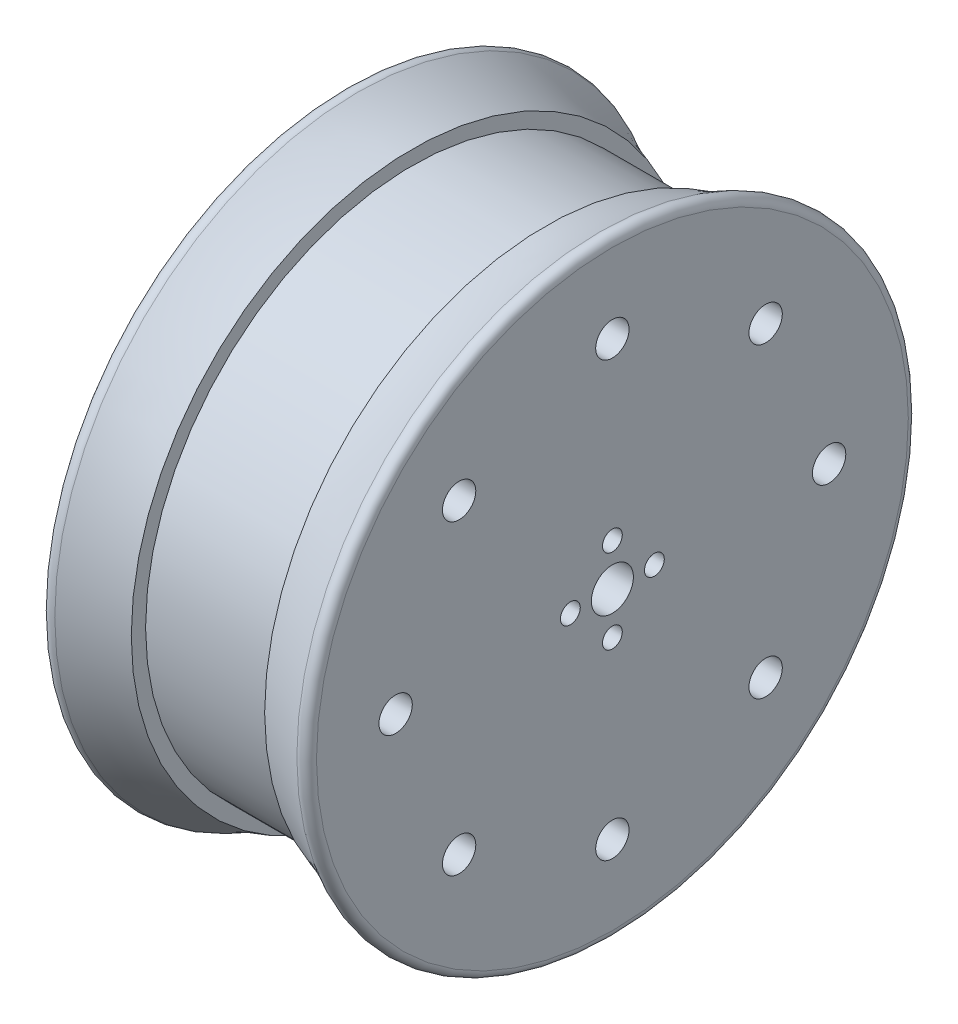
ISO-10303-21;
HEADER;
FILE_DESCRIPTION(('STEP AP214'),'2;1');
FILE_NAME('part.step','',(''),(''),'','','');
FILE_SCHEMA(('AUTOMOTIVE_DESIGN { 1 0 10303 214 1 1 1 1 }'));
ENDSEC;
DATA;
#1=APPLICATION_CONTEXT('core data for automotive mechanical design processes');
#2=APPLICATION_PROTOCOL_DEFINITION('international standard','automotive_design',2000,#1);
#3=PRODUCT_CONTEXT('',#1,'mechanical');
#4=PRODUCT('Part','Part','',(#3));
#5=PRODUCT_RELATED_PRODUCT_CATEGORY('part','',(#4));
#6=PRODUCT_DEFINITION_FORMATION('','',#4);
#7=PRODUCT_DEFINITION_CONTEXT('part definition',#1,'design');
#8=PRODUCT_DEFINITION('design','',#6,#7);
#9=PRODUCT_DEFINITION_SHAPE('','',#8);
#10=(LENGTH_UNIT() NAMED_UNIT(*) SI_UNIT(.MILLI.,.METRE.));
#11=(NAMED_UNIT(*) PLANE_ANGLE_UNIT() SI_UNIT($,.RADIAN.));
#12=(NAMED_UNIT(*) SI_UNIT($,.STERADIAN.) SOLID_ANGLE_UNIT());
#13=UNCERTAINTY_MEASURE_WITH_UNIT(LENGTH_MEASURE(1.E-05),#10,'distance_accuracy_value','');
#14=(GEOMETRIC_REPRESENTATION_CONTEXT(3) GLOBAL_UNCERTAINTY_ASSIGNED_CONTEXT((#13)) GLOBAL_UNIT_ASSIGNED_CONTEXT((#10,
#11,#12)) REPRESENTATION_CONTEXT('',''));
#15=CARTESIAN_POINT('',(0.,0.,0.));
#16=DIRECTION('',(0.,0.,1.));
#17=DIRECTION('',(1.,0.,0.));
#18=AXIS2_PLACEMENT_3D('',#15,#16,#17);
#19=CARTESIAN_POINT('',(25.4,0.,0.));
#20=DIRECTION('',(1.,0.,0.));
#21=DIRECTION('',(0.,0.,-1.));
#22=AXIS2_PLACEMENT_3D('',#19,#20,#21);
#23=PLANE('',#22);
#24=CARTESIAN_POINT('',(25.4,29.1858323934735,29.1858323934742));
#25=DIRECTION('',(1.,0.,0.));
#26=DIRECTION('',(0.,0.,-1.));
#27=AXIS2_PLACEMENT_3D('',#24,#25,#26);
#28=CIRCLE('',#27,3.17500000000134);
#29=CARTESIAN_POINT('',(25.4,29.1858323934735,26.0108323934729));
#30=VERTEX_POINT('',#29);
#31=EDGE_CURVE('E136',#30,#30,#28,.T.);
#32=ORIENTED_EDGE('',*,*,#31,.F.);
#33=EDGE_LOOP('',(#32));
#34=FACE_BOUND('',#33,.T.);
#35=CARTESIAN_POINT('',(25.4,-1.75965908510989E-12,41.2749999999982));
#36=DIRECTION('',(1.,0.,0.));
#37=DIRECTION('',(0.,0.,-1.));
#38=AXIS2_PLACEMENT_3D('',#35,#36,#37);
#39=CIRCLE('',#38,3.1750000000026);
#40=CARTESIAN_POINT('',(25.4,-1.75965908510989E-12,38.0999999999956));
#41=VERTEX_POINT('',#40);
#42=EDGE_CURVE('E130',#41,#41,#39,.T.);
#43=ORIENTED_EDGE('',*,*,#42,.F.);
#44=EDGE_LOOP('',(#43));
#45=FACE_BOUND('',#44,.T.);
#46=CARTESIAN_POINT('',(25.4,-29.185832393476,29.1858323934718));
#47=DIRECTION('',(1.,0.,0.));
#48=DIRECTION('',(0.,0.,-1.));
#49=AXIS2_PLACEMENT_3D('',#46,#47,#48);
#50=CIRCLE('',#49,3.17500000000357);
#51=CARTESIAN_POINT('',(25.4,-29.185832393476,26.0108323934682));
#52=VERTEX_POINT('',#51);
#53=EDGE_CURVE('E124',#52,#52,#50,.T.);
#54=ORIENTED_EDGE('',*,*,#53,.F.);
#55=EDGE_LOOP('',(#54));
#56=FACE_BOUND('',#55,.T.);
#57=CARTESIAN_POINT('',(25.4,-41.275,-3.50920871089281E-12));
#58=DIRECTION('',(1.,0.,0.));
#59=DIRECTION('',(0.,0.,-1.));
#60=AXIS2_PLACEMENT_3D('',#57,#58,#59);
#61=CIRCLE('',#60,3.17500000000363);
#62=CARTESIAN_POINT('',(25.4,-41.275,-3.17500000000714));
#63=VERTEX_POINT('',#62);
#64=EDGE_CURVE('E118',#63,#63,#61,.T.);
#65=ORIENTED_EDGE('',*,*,#64,.F.);
#66=EDGE_LOOP('',(#65));
#67=FACE_BOUND('',#66,.T.);
#68=CARTESIAN_POINT('',(25.4,-29.1858323934735,-29.1858323934777));
#69=DIRECTION('',(1.,0.,0.));
#70=DIRECTION('',(0.,0.,-1.));
#71=AXIS2_PLACEMENT_3D('',#68,#69,#70);
#72=CIRCLE('',#71,3.17500000000271);
#73=CARTESIAN_POINT('',(25.4,-29.1858323934735,-32.3608323934805));
#74=VERTEX_POINT('',#73);
#75=EDGE_CURVE('E112',#74,#74,#72,.T.);
#76=ORIENTED_EDGE('',*,*,#75,.F.);
#77=EDGE_LOOP('',(#76));
#78=FACE_BOUND('',#77,.T.);
#79=CARTESIAN_POINT('',(25.4,1.75460435544641E-12,-41.2750000000018));
#80=DIRECTION('',(1.,0.,0.));
#81=DIRECTION('',(0.,0.,-1.));
#82=AXIS2_PLACEMENT_3D('',#79,#80,#81);
#83=CIRCLE('',#82,3.1750000000013);
#84=CARTESIAN_POINT('',(25.4,1.75460435544641E-12,-44.4500000000031));
#85=VERTEX_POINT('',#84);
#86=EDGE_CURVE('E106',#85,#85,#83,.T.);
#87=ORIENTED_EDGE('',*,*,#86,.F.);
#88=EDGE_LOOP('',(#87));
#89=FACE_BOUND('',#88,.T.);
#90=CARTESIAN_POINT('',(25.4,29.185832393476,-29.1858323934753));
#91=DIRECTION('',(1.,0.,0.));
#92=DIRECTION('',(0.,0.,-1.));
#93=AXIS2_PLACEMENT_3D('',#90,#91,#92);
#94=CIRCLE('',#93,3.17500000000019);
#95=CARTESIAN_POINT('',(25.4,29.185832393476,-32.3608323934755));
#96=VERTEX_POINT('',#95);
#97=EDGE_CURVE('E100',#96,#96,#94,.T.);
#98=ORIENTED_EDGE('',*,*,#97,.F.);
#99=EDGE_LOOP('',(#98));
#100=FACE_BOUND('',#99,.T.);
#101=CARTESIAN_POINT('',(25.4,41.275,0.));
#102=DIRECTION('',(1.,0.,0.));
#103=DIRECTION('',(0.,0.,-1.));
#104=AXIS2_PLACEMENT_3D('',#101,#102,#103);
#105=CIRCLE('',#104,3.175);
#106=CARTESIAN_POINT('',(25.4,41.275,-3.175));
#107=VERTEX_POINT('',#106);
#108=EDGE_CURVE('E94',#107,#107,#105,.T.);
#109=ORIENTED_EDGE('',*,*,#108,.F.);
#110=EDGE_LOOP('',(#109));
#111=FACE_BOUND('',#110,.T.);
#112=CARTESIAN_POINT('',(25.4,0.,0.));
#113=DIRECTION('',(1.,0.,0.));
#114=DIRECTION('',(0.,0.,-1.));
#115=AXIS2_PLACEMENT_3D('',#112,#113,#114);
#116=CIRCLE('',#115,56.3572046071545);
#117=CARTESIAN_POINT('',(25.4,0.,-56.3572046071545));
#118=VERTEX_POINT('',#117);
#119=EDGE_CURVE('E42',#118,#118,#116,.T.);
#120=ORIENTED_EDGE('',*,*,#119,.T.);
#121=EDGE_LOOP('',(#120));
#122=FACE_BOUND('',#121,.T.);
#123=CARTESIAN_POINT('',(25.4,-4.57011557697138E-13,7.99999999999954));
#124=DIRECTION('',(1.,0.,0.));
#125=DIRECTION('',(0.,0.,-1.));
#126=AXIS2_PLACEMENT_3D('',#123,#124,#125);
#127=CIRCLE('',#126,1.88500000000098);
#128=CARTESIAN_POINT('',(25.4,-4.57011557697138E-13,6.11499999999856));
#129=VERTEX_POINT('',#128);
#130=EDGE_CURVE('E88',#129,#129,#127,.T.);
#131=ORIENTED_EDGE('',*,*,#130,.F.);
#132=EDGE_LOOP('',(#131));
#133=FACE_BOUND('',#132,.T.);
#134=CARTESIAN_POINT('',(25.4,-8.,-9.12063680515641E-13));
#135=DIRECTION('',(1.,0.,0.));
#136=DIRECTION('',(0.,0.,-1.));
#137=AXIS2_PLACEMENT_3D('',#134,#135,#136);
#138=CIRCLE('',#137,1.88500000000098);
#139=CARTESIAN_POINT('',(25.4,-8.,-1.88500000000189));
#140=VERTEX_POINT('',#139);
#141=EDGE_CURVE('E82',#140,#140,#138,.T.);
#142=ORIENTED_EDGE('',*,*,#141,.F.);
#143=EDGE_LOOP('',(#142));
#144=FACE_BOUND('',#143,.T.);
#145=CARTESIAN_POINT('',(25.4,4.56031840257821E-13,-8.00000000000045));
#146=DIRECTION('',(1.,0.,0.));
#147=DIRECTION('',(0.,0.,-1.));
#148=AXIS2_PLACEMENT_3D('',#145,#146,#147);
#149=CIRCLE('',#148,1.88500000000098);
#150=CARTESIAN_POINT('',(25.4,4.56031840257821E-13,-9.88500000000144));
#151=VERTEX_POINT('',#150);
#152=EDGE_CURVE('E76',#151,#151,#149,.T.);
#153=ORIENTED_EDGE('',*,*,#152,.F.);
#154=EDGE_LOOP('',(#153));
#155=FACE_BOUND('',#154,.T.);
#156=CARTESIAN_POINT('',(25.4,8.,0.));
#157=DIRECTION('',(1.,0.,0.));
#158=DIRECTION('',(0.,0.,-1.));
#159=AXIS2_PLACEMENT_3D('',#156,#157,#158);
#160=CIRCLE('',#159,1.88500000000098);
#161=CARTESIAN_POINT('',(25.4,8.,-1.88500000000098));
#162=VERTEX_POINT('',#161);
#163=EDGE_CURVE('E70',#162,#162,#160,.T.);
#164=ORIENTED_EDGE('',*,*,#163,.F.);
#165=EDGE_LOOP('',(#164));
#166=FACE_BOUND('',#165,.T.);
#167=CARTESIAN_POINT('',(25.4,0.,0.));
#168=DIRECTION('',(1.,0.,0.));
#169=DIRECTION('',(0.,0.,-1.));
#170=AXIS2_PLACEMENT_3D('',#167,#168,#169);
#171=CIRCLE('',#170,4.);
#172=CARTESIAN_POINT('',(25.4,0.,-4.));
#173=VERTEX_POINT('',#172);
#174=EDGE_CURVE('E64',#173,#173,#171,.T.);
#175=ORIENTED_EDGE('',*,*,#174,.F.);
#176=EDGE_LOOP('',(#175));
#177=FACE_BOUND('',#176,.T.);
#178=ADVANCED_FACE('F31',(#34,#45,#56,#67,#78,#89,#100,#111,#122,#133,#144,#155,#166,#177),#23,.T.);
#179=CARTESIAN_POINT('',(0.,0.,0.));
#180=DIRECTION('',(-1.,0.,0.));
#181=DIRECTION('',(0.,0.,1.));
#182=AXIS2_PLACEMENT_3D('',#179,#180,#181);
#183=TOROIDAL_SURFACE('',#182,99.425,47.625);
#184=CARTESIAN_POINT('',(23.0443548387097,0.,0.));
#185=DIRECTION('',(-1.,0.,0.));
#186=DIRECTION('',(0.,0.,1.));
#187=AXIS2_PLACEMENT_3D('',#184,#185,#186);
#188=CIRCLE('',#187,57.7464883295044);
#189=CARTESIAN_POINT('',(23.0443548387097,0.,57.7464883295044));
#190=VERTEX_POINT('',#189);
#191=EDGE_CURVE('E46',#190,#190,#188,.T.);
#192=ORIENTED_EDGE('',*,*,#191,.T.);
#193=EDGE_LOOP('',(#192));
#194=FACE_BOUND('',#193,.T.);
#195=CARTESIAN_POINT('',(12.7,0.,0.));
#196=DIRECTION('',(-1.,0.,0.));
#197=DIRECTION('',(0.,0.,1.));
#198=AXIS2_PLACEMENT_3D('',#195,#196,#197);
#199=CIRCLE('',#198,53.5245574640069);
#200=CARTESIAN_POINT('',(12.7,0.,53.5245574640069));
#201=VERTEX_POINT('',#200);
#202=EDGE_CURVE('E51',#201,#201,#199,.T.);
#203=ORIENTED_EDGE('',*,*,#202,.F.);
#204=EDGE_LOOP('',(#203));
#205=FACE_BOUND('',#204,.T.);
#206=ADVANCED_FACE('F154',(#194,#205),#183,.F.);
#207=CARTESIAN_POINT('',(12.7,-50.8,0.));
#208=DIRECTION('',(-1.,0.,0.));
#209=DIRECTION('',(0.,0.,1.));
#210=AXIS2_PLACEMENT_3D('',#207,#208,#209);
#211=PLANE('',#210);
#212=ORIENTED_EDGE('',*,*,#202,.T.);
#213=EDGE_LOOP('',(#212));
#214=FACE_BOUND('',#213,.T.);
#215=CARTESIAN_POINT('',(12.7,0.,0.));
#216=DIRECTION('',(-1.,0.,0.));
#217=DIRECTION('',(0.,0.,1.));
#218=AXIS2_PLACEMENT_3D('',#215,#216,#217);
#219=CIRCLE('',#218,50.8);
#220=CARTESIAN_POINT('',(12.7,0.,50.8));
#221=VERTEX_POINT('',#220);
#222=EDGE_CURVE('E54',#221,#221,#219,.T.);
#223=ORIENTED_EDGE('',*,*,#222,.F.);
#224=EDGE_LOOP('',(#223));
#225=FACE_BOUND('',#224,.T.);
#226=ADVANCED_FACE('F208',(#214,#225),#211,.T.);
#227=CARTESIAN_POINT('',(-40.905271883208,0.,0.));
#228=DIRECTION('',(-1.,0.,0.));
#229=DIRECTION('',(0.,0.,1.));
#230=AXIS2_PLACEMENT_3D('',#227,#228,#229);
#231=CYLINDRICAL_SURFACE('',#230,50.8);
#232=ORIENTED_EDGE('',*,*,#222,.T.);
#233=EDGE_LOOP('',(#232));
#234=FACE_BOUND('',#233,.T.);
#235=CARTESIAN_POINT('',(-12.7,0.,0.));
#236=DIRECTION('',(-1.,0.,0.));
#237=DIRECTION('',(0.,0.,1.));
#238=AXIS2_PLACEMENT_3D('',#235,#236,#237);
#239=CIRCLE('',#238,50.8);
#240=CARTESIAN_POINT('',(-12.7,0.,50.8));
#241=VERTEX_POINT('',#240);
#242=EDGE_CURVE('E57',#241,#241,#239,.T.);
#243=ORIENTED_EDGE('',*,*,#242,.F.);
#244=EDGE_LOOP('',(#243));
#245=FACE_BOUND('',#244,.T.);
#246=ADVANCED_FACE('F204',(#234,#245),#231,.T.);
#247=CARTESIAN_POINT('',(-12.7,-50.8,0.));
#248=DIRECTION('',(1.,0.,0.));
#249=DIRECTION('',(0.,0.,-1.));
#250=AXIS2_PLACEMENT_3D('',#247,#248,#249);
#251=PLANE('',#250);
#252=ORIENTED_EDGE('',*,*,#242,.T.);
#253=EDGE_LOOP('',(#252));
#254=FACE_BOUND('',#253,.T.);
#255=CARTESIAN_POINT('',(-12.7,0.,0.));
#256=DIRECTION('',(-1.,0.,0.));
#257=DIRECTION('',(0.,0.,1.));
#258=AXIS2_PLACEMENT_3D('',#255,#256,#257);
#259=CIRCLE('',#258,53.524557464007);
#260=CARTESIAN_POINT('',(-12.7,0.,53.524557464007));
#261=VERTEX_POINT('',#260);
#262=EDGE_CURVE('E60',#261,#261,#259,.T.);
#263=ORIENTED_EDGE('',*,*,#262,.F.);
#264=EDGE_LOOP('',(#263));
#265=FACE_BOUND('',#264,.T.);
#266=ADVANCED_FACE('F201',(#254,#265),#251,.T.);
#267=CARTESIAN_POINT('',(0.,0.,0.));
#268=DIRECTION('',(-1.,0.,0.));
#269=DIRECTION('',(0.,0.,1.));
#270=AXIS2_PLACEMENT_3D('',#267,#268,#269);
#271=TOROIDAL_SURFACE('',#270,99.425,47.625);
#272=CARTESIAN_POINT('',(-23.0443548387097,0.,0.));
#273=DIRECTION('',(1.,0.,0.));
#274=DIRECTION('',(0.,0.,-1.));
#275=AXIS2_PLACEMENT_3D('',#272,#273,#274);
#276=CIRCLE('',#275,57.7464883295044);
#277=CARTESIAN_POINT('',(-23.0443548387097,0.,-57.7464883295044));
#278=VERTEX_POINT('',#277);
#279=EDGE_CURVE('E10',#278,#278,#276,.T.);
#280=ORIENTED_EDGE('',*,*,#279,.T.);
#281=EDGE_LOOP('',(#280));
#282=FACE_BOUND('',#281,.T.);
#283=ORIENTED_EDGE('',*,*,#262,.T.);
#284=EDGE_LOOP('',(#283));
#285=FACE_BOUND('',#284,.T.);
#286=ADVANCED_FACE('F194',(#282,#285),#271,.F.);
#287=CARTESIAN_POINT('',(-25.4,0.,0.));
#288=DIRECTION('',(-1.,0.,0.));
#289=DIRECTION('',(0.,0.,1.));
#290=AXIS2_PLACEMENT_3D('',#287,#288,#289);
#291=PLANE('',#290);
#292=CARTESIAN_POINT('',(-25.4,29.1858323934735,29.1858323934742));
#293=DIRECTION('',(1.,0.,0.));
#294=DIRECTION('',(0.,0.,-1.));
#295=AXIS2_PLACEMENT_3D('',#292,#293,#294);
#296=CIRCLE('',#295,3.17500000000134);
#297=CARTESIAN_POINT('',(-25.4,29.1858323934735,26.0108323934729));
#298=VERTEX_POINT('',#297);
#299=EDGE_CURVE('E133',#298,#298,#296,.T.);
#300=ORIENTED_EDGE('',*,*,#299,.T.);
#301=EDGE_LOOP('',(#300));
#302=FACE_BOUND('',#301,.T.);
#303=CARTESIAN_POINT('',(-25.4,-1.75965908510989E-12,41.2749999999982));
#304=DIRECTION('',(1.,0.,0.));
#305=DIRECTION('',(0.,0.,-1.));
#306=AXIS2_PLACEMENT_3D('',#303,#304,#305);
#307=CIRCLE('',#306,3.1750000000026);
#308=CARTESIAN_POINT('',(-25.4,-1.75965908510989E-12,38.0999999999956));
#309=VERTEX_POINT('',#308);
#310=EDGE_CURVE('E127',#309,#309,#307,.T.);
#311=ORIENTED_EDGE('',*,*,#310,.T.);
#312=EDGE_LOOP('',(#311));
#313=FACE_BOUND('',#312,.T.);
#314=CARTESIAN_POINT('',(-25.4,-29.185832393476,29.1858323934718));
#315=DIRECTION('',(1.,0.,0.));
#316=DIRECTION('',(0.,0.,-1.));
#317=AXIS2_PLACEMENT_3D('',#314,#315,#316);
#318=CIRCLE('',#317,3.17500000000357);
#319=CARTESIAN_POINT('',(-25.4,-29.185832393476,26.0108323934682));
#320=VERTEX_POINT('',#319);
#321=EDGE_CURVE('E121',#320,#320,#318,.T.);
#322=ORIENTED_EDGE('',*,*,#321,.T.);
#323=EDGE_LOOP('',(#322));
#324=FACE_BOUND('',#323,.T.);
#325=CARTESIAN_POINT('',(-25.4,-41.275,-3.50920871089281E-12));
#326=DIRECTION('',(1.,0.,0.));
#327=DIRECTION('',(0.,0.,-1.));
#328=AXIS2_PLACEMENT_3D('',#325,#326,#327);
#329=CIRCLE('',#328,3.17500000000363);
#330=CARTESIAN_POINT('',(-25.4,-41.275,-3.17500000000714));
#331=VERTEX_POINT('',#330);
#332=EDGE_CURVE('E115',#331,#331,#329,.T.);
#333=ORIENTED_EDGE('',*,*,#332,.T.);
#334=EDGE_LOOP('',(#333));
#335=FACE_BOUND('',#334,.T.);
#336=CARTESIAN_POINT('',(-25.4,-29.1858323934735,-29.1858323934777));
#337=DIRECTION('',(1.,0.,0.));
#338=DIRECTION('',(0.,0.,-1.));
#339=AXIS2_PLACEMENT_3D('',#336,#337,#338);
#340=CIRCLE('',#339,3.17500000000271);
#341=CARTESIAN_POINT('',(-25.4,-29.1858323934735,-32.3608323934805));
#342=VERTEX_POINT('',#341);
#343=EDGE_CURVE('E109',#342,#342,#340,.T.);
#344=ORIENTED_EDGE('',*,*,#343,.T.);
#345=EDGE_LOOP('',(#344));
#346=FACE_BOUND('',#345,.T.);
#347=CARTESIAN_POINT('',(-25.4,1.75460435544641E-12,-41.2750000000018));
#348=DIRECTION('',(1.,0.,0.));
#349=DIRECTION('',(0.,0.,-1.));
#350=AXIS2_PLACEMENT_3D('',#347,#348,#349);
#351=CIRCLE('',#350,3.1750000000013);
#352=CARTESIAN_POINT('',(-25.4,1.75460435544641E-12,-44.4500000000031));
#353=VERTEX_POINT('',#352);
#354=EDGE_CURVE('E103',#353,#353,#351,.T.);
#355=ORIENTED_EDGE('',*,*,#354,.T.);
#356=EDGE_LOOP('',(#355));
#357=FACE_BOUND('',#356,.T.);
#358=CARTESIAN_POINT('',(-25.4,29.185832393476,-29.1858323934753));
#359=DIRECTION('',(1.,0.,0.));
#360=DIRECTION('',(0.,0.,-1.));
#361=AXIS2_PLACEMENT_3D('',#358,#359,#360);
#362=CIRCLE('',#361,3.17500000000019);
#363=CARTESIAN_POINT('',(-25.4,29.185832393476,-32.3608323934755));
#364=VERTEX_POINT('',#363);
#365=EDGE_CURVE('E97',#364,#364,#362,.T.);
#366=ORIENTED_EDGE('',*,*,#365,.T.);
#367=EDGE_LOOP('',(#366));
#368=FACE_BOUND('',#367,.T.);
#369=CARTESIAN_POINT('',(-25.4,41.275,0.));
#370=DIRECTION('',(1.,0.,0.));
#371=DIRECTION('',(0.,0.,-1.));
#372=AXIS2_PLACEMENT_3D('',#369,#370,#371);
#373=CIRCLE('',#372,3.175);
#374=CARTESIAN_POINT('',(-25.4,41.275,-3.175));
#375=VERTEX_POINT('',#374);
#376=EDGE_CURVE('E91',#375,#375,#373,.T.);
#377=ORIENTED_EDGE('',*,*,#376,.T.);
#378=EDGE_LOOP('',(#377));
#379=FACE_BOUND('',#378,.T.);
#380=CARTESIAN_POINT('',(-25.4,0.,0.));
#381=DIRECTION('',(-1.,0.,0.));
#382=DIRECTION('',(0.,0.,1.));
#383=AXIS2_PLACEMENT_3D('',#380,#381,#382);
#384=CIRCLE('',#383,56.3572046071546);
#385=CARTESIAN_POINT('',(-25.4,0.,56.3572046071546));
#386=VERTEX_POINT('',#385);
#387=EDGE_CURVE('E38',#386,#386,#384,.T.);
#388=ORIENTED_EDGE('',*,*,#387,.T.);
#389=EDGE_LOOP('',(#388));
#390=FACE_BOUND('',#389,.T.);
#391=CARTESIAN_POINT('',(-25.4,-4.57011557697138E-13,7.99999999999954));
#392=DIRECTION('',(1.,0.,0.));
#393=DIRECTION('',(0.,0.,-1.));
#394=AXIS2_PLACEMENT_3D('',#391,#392,#393);
#395=CIRCLE('',#394,1.88500000000098);
#396=CARTESIAN_POINT('',(-25.4,-4.57011557697138E-13,6.11499999999856));
#397=VERTEX_POINT('',#396);
#398=EDGE_CURVE('E85',#397,#397,#395,.T.);
#399=ORIENTED_EDGE('',*,*,#398,.T.);
#400=EDGE_LOOP('',(#399));
#401=FACE_BOUND('',#400,.T.);
#402=CARTESIAN_POINT('',(-25.4,-8.,-9.12063680515641E-13));
#403=DIRECTION('',(1.,0.,0.));
#404=DIRECTION('',(0.,0.,-1.));
#405=AXIS2_PLACEMENT_3D('',#402,#403,#404);
#406=CIRCLE('',#405,1.88500000000098);
#407=CARTESIAN_POINT('',(-25.4,-8.,-1.88500000000189));
#408=VERTEX_POINT('',#407);
#409=EDGE_CURVE('E79',#408,#408,#406,.T.);
#410=ORIENTED_EDGE('',*,*,#409,.T.);
#411=EDGE_LOOP('',(#410));
#412=FACE_BOUND('',#411,.T.);
#413=CARTESIAN_POINT('',(-25.4,4.56031840257821E-13,-8.00000000000045));
#414=DIRECTION('',(1.,0.,0.));
#415=DIRECTION('',(0.,0.,-1.));
#416=AXIS2_PLACEMENT_3D('',#413,#414,#415);
#417=CIRCLE('',#416,1.88500000000098);
#418=CARTESIAN_POINT('',(-25.4,4.56031840257821E-13,-9.88500000000144));
#419=VERTEX_POINT('',#418);
#420=EDGE_CURVE('E73',#419,#419,#417,.T.);
#421=ORIENTED_EDGE('',*,*,#420,.T.);
#422=EDGE_LOOP('',(#421));
#423=FACE_BOUND('',#422,.T.);
#424=CARTESIAN_POINT('',(-25.4,8.,0.));
#425=DIRECTION('',(1.,0.,0.));
#426=DIRECTION('',(0.,0.,-1.));
#427=AXIS2_PLACEMENT_3D('',#424,#425,#426);
#428=CIRCLE('',#427,1.88500000000098);
#429=CARTESIAN_POINT('',(-25.4,8.,-1.88500000000098));
#430=VERTEX_POINT('',#429);
#431=EDGE_CURVE('E67',#430,#430,#428,.T.);
#432=ORIENTED_EDGE('',*,*,#431,.T.);
#433=EDGE_LOOP('',(#432));
#434=FACE_BOUND('',#433,.T.);
#435=CARTESIAN_POINT('',(-25.4,0.,0.));
#436=DIRECTION('',(1.,0.,0.));
#437=DIRECTION('',(0.,0.,-1.));
#438=AXIS2_PLACEMENT_3D('',#435,#436,#437);
#439=CIRCLE('',#438,4.);
#440=CARTESIAN_POINT('',(-25.4,0.,-4.));
#441=VERTEX_POINT('',#440);
#442=EDGE_CURVE('E63',#441,#441,#439,.T.);
#443=ORIENTED_EDGE('',*,*,#442,.T.);
#444=EDGE_LOOP('',(#443));
#445=FACE_BOUND('',#444,.T.);
#446=ADVANCED_FACE('F142',(#302,#313,#324,#335,#346,#357,#368,#379,#390,#401,#412,#423,#434,
#445),#291,.T.);
#447=CARTESIAN_POINT('',(-25.4,0.,0.));
#448=DIRECTION('',(1.,0.,0.));
#449=DIRECTION('',(0.,0.,-1.));
#450=AXIS2_PLACEMENT_3D('',#447,#448,#449);
#451=CYLINDRICAL_SURFACE('',#450,4.);
#452=ORIENTED_EDGE('',*,*,#442,.F.);
#453=EDGE_LOOP('',(#452));
#454=FACE_BOUND('',#453,.T.);
#455=ORIENTED_EDGE('',*,*,#174,.T.);
#456=EDGE_LOOP('',(#455));
#457=FACE_BOUND('',#456,.T.);
#458=ADVANCED_FACE('F182',(#454,#457),#451,.F.);
#459=CARTESIAN_POINT('',(-25.4,8.,0.));
#460=DIRECTION('',(1.,0.,0.));
#461=DIRECTION('',(0.,0.,-1.));
#462=AXIS2_PLACEMENT_3D('',#459,#460,#461);
#463=CYLINDRICAL_SURFACE('',#462,1.88500000000098);
#464=ORIENTED_EDGE('',*,*,#431,.F.);
#465=EDGE_LOOP('',(#464));
#466=FACE_BOUND('',#465,.T.);
#467=ORIENTED_EDGE('',*,*,#163,.T.);
#468=EDGE_LOOP('',(#467));
#469=FACE_BOUND('',#468,.T.);
#470=ADVANCED_FACE('F184',(#466,#469),#463,.F.);
#471=CARTESIAN_POINT('',(-25.4,4.56031840257821E-13,-8.00000000000045));
#472=DIRECTION('',(1.,0.,0.));
#473=DIRECTION('',(0.,0.,-1.));
#474=AXIS2_PLACEMENT_3D('',#471,#472,#473);
#475=CYLINDRICAL_SURFACE('',#474,1.88500000000098);
#476=ORIENTED_EDGE('',*,*,#420,.F.);
#477=EDGE_LOOP('',(#476));
#478=FACE_BOUND('',#477,.T.);
#479=ORIENTED_EDGE('',*,*,#152,.T.);
#480=EDGE_LOOP('',(#479));
#481=FACE_BOUND('',#480,.T.);
#482=ADVANCED_FACE('F191',(#478,#481),#475,.F.);
#483=CARTESIAN_POINT('',(-25.4,-8.,-9.12063680515641E-13));
#484=DIRECTION('',(1.,0.,0.));
#485=DIRECTION('',(0.,0.,-1.));
#486=AXIS2_PLACEMENT_3D('',#483,#484,#485);
#487=CYLINDRICAL_SURFACE('',#486,1.88500000000098);
#488=ORIENTED_EDGE('',*,*,#409,.F.);
#489=EDGE_LOOP('',(#488));
#490=FACE_BOUND('',#489,.T.);
#491=ORIENTED_EDGE('',*,*,#141,.T.);
#492=EDGE_LOOP('',(#491));
#493=FACE_BOUND('',#492,.T.);
#494=ADVANCED_FACE('F225',(#490,#493),#487,.F.);
#495=CARTESIAN_POINT('',(-25.4,-4.57011557697138E-13,7.99999999999954));
#496=DIRECTION('',(1.,0.,0.));
#497=DIRECTION('',(0.,0.,-1.));
#498=AXIS2_PLACEMENT_3D('',#495,#496,#497);
#499=CYLINDRICAL_SURFACE('',#498,1.88500000000098);
#500=ORIENTED_EDGE('',*,*,#398,.F.);
#501=EDGE_LOOP('',(#500));
#502=FACE_BOUND('',#501,.T.);
#503=ORIENTED_EDGE('',*,*,#130,.T.);
#504=EDGE_LOOP('',(#503));
#505=FACE_BOUND('',#504,.T.);
#506=ADVANCED_FACE('F217',(#502,#505),#499,.F.);
#507=CARTESIAN_POINT('',(23.8125,0.,0.));
#508=DIRECTION('',(-1.,0.,0.));
#509=DIRECTION('',(0.,0.,1.));
#510=AXIS2_PLACEMENT_3D('',#507,#508,#509);
#511=TOROIDAL_SURFACE('',#510,56.3572046071545,1.5875);
#512=ORIENTED_EDGE('',*,*,#119,.F.);
#513=EDGE_LOOP('',(#512));
#514=FACE_BOUND('',#513,.T.);
#515=ORIENTED_EDGE('',*,*,#191,.F.);
#516=EDGE_LOOP('',(#515));
#517=FACE_BOUND('',#516,.T.);
#518=ADVANCED_FACE('F215',(#514,#517),#511,.T.);
#519=CARTESIAN_POINT('',(-23.8125,0.,0.));
#520=DIRECTION('',(1.,0.,0.));
#521=DIRECTION('',(0.,0.,-1.));
#522=AXIS2_PLACEMENT_3D('',#519,#520,#521);
#523=TOROIDAL_SURFACE('',#522,56.3572046071546,1.5875);
#524=ORIENTED_EDGE('',*,*,#279,.F.);
#525=EDGE_LOOP('',(#524));
#526=FACE_BOUND('',#525,.T.);
#527=ORIENTED_EDGE('',*,*,#387,.F.);
#528=EDGE_LOOP('',(#527));
#529=FACE_BOUND('',#528,.T.);
#530=ADVANCED_FACE('F33',(#526,#529),#523,.T.);
#531=CARTESIAN_POINT('',(-25.4,41.275,0.));
#532=DIRECTION('',(1.,0.,0.));
#533=DIRECTION('',(0.,0.,-1.));
#534=AXIS2_PLACEMENT_3D('',#531,#532,#533);
#535=CYLINDRICAL_SURFACE('',#534,3.175);
#536=ORIENTED_EDGE('',*,*,#376,.F.);
#537=EDGE_LOOP('',(#536));
#538=FACE_BOUND('',#537,.T.);
#539=ORIENTED_EDGE('',*,*,#108,.T.);
#540=EDGE_LOOP('',(#539));
#541=FACE_BOUND('',#540,.T.);
#542=ADVANCED_FACE('F223',(#538,#541),#535,.F.);
#543=CARTESIAN_POINT('',(-25.4,29.185832393476,-29.1858323934753));
#544=DIRECTION('',(1.,0.,0.));
#545=DIRECTION('',(0.,0.,-1.));
#546=AXIS2_PLACEMENT_3D('',#543,#544,#545);
#547=CYLINDRICAL_SURFACE('',#546,3.17500000000019);
#548=ORIENTED_EDGE('',*,*,#365,.F.);
#549=EDGE_LOOP('',(#548));
#550=FACE_BOUND('',#549,.T.);
#551=ORIENTED_EDGE('',*,*,#97,.T.);
#552=EDGE_LOOP('',(#551));
#553=FACE_BOUND('',#552,.T.);
#554=ADVANCED_FACE('F315',(#550,#553),#547,.F.);
#555=CARTESIAN_POINT('',(-25.4,1.75460435544641E-12,-41.2750000000018));
#556=DIRECTION('',(1.,0.,0.));
#557=DIRECTION('',(0.,0.,-1.));
#558=AXIS2_PLACEMENT_3D('',#555,#556,#557);
#559=CYLINDRICAL_SURFACE('',#558,3.1750000000013);
#560=ORIENTED_EDGE('',*,*,#354,.F.);
#561=EDGE_LOOP('',(#560));
#562=FACE_BOUND('',#561,.T.);
#563=ORIENTED_EDGE('',*,*,#86,.T.);
#564=EDGE_LOOP('',(#563));
#565=FACE_BOUND('',#564,.T.);
#566=ADVANCED_FACE('F324',(#562,#565),#559,.F.);
#567=CARTESIAN_POINT('',(-25.4,-29.1858323934735,-29.1858323934777));
#568=DIRECTION('',(1.,0.,0.));
#569=DIRECTION('',(0.,0.,-1.));
#570=AXIS2_PLACEMENT_3D('',#567,#568,#569);
#571=CYLINDRICAL_SURFACE('',#570,3.17500000000271);
#572=ORIENTED_EDGE('',*,*,#343,.F.);
#573=EDGE_LOOP('',(#572));
#574=FACE_BOUND('',#573,.T.);
#575=ORIENTED_EDGE('',*,*,#75,.T.);
#576=EDGE_LOOP('',(#575));
#577=FACE_BOUND('',#576,.T.);
#578=ADVANCED_FACE('F333',(#574,#577),#571,.F.);
#579=CARTESIAN_POINT('',(-25.4,-41.275,-3.50920871089281E-12));
#580=DIRECTION('',(1.,0.,0.));
#581=DIRECTION('',(0.,0.,-1.));
#582=AXIS2_PLACEMENT_3D('',#579,#580,#581);
#583=CYLINDRICAL_SURFACE('',#582,3.17500000000363);
#584=ORIENTED_EDGE('',*,*,#332,.F.);
#585=EDGE_LOOP('',(#584));
#586=FACE_BOUND('',#585,.T.);
#587=ORIENTED_EDGE('',*,*,#64,.T.);
#588=EDGE_LOOP('',(#587));
#589=FACE_BOUND('',#588,.T.);
#590=ADVANCED_FACE('F343',(#586,#589),#583,.F.);
#591=CARTESIAN_POINT('',(-25.4,-29.185832393476,29.1858323934718));
#592=DIRECTION('',(1.,0.,0.));
#593=DIRECTION('',(0.,0.,-1.));
#594=AXIS2_PLACEMENT_3D('',#591,#592,#593);
#595=CYLINDRICAL_SURFACE('',#594,3.17500000000357);
#596=ORIENTED_EDGE('',*,*,#321,.F.);
#597=EDGE_LOOP('',(#596));
#598=FACE_BOUND('',#597,.T.);
#599=ORIENTED_EDGE('',*,*,#53,.T.);
#600=EDGE_LOOP('',(#599));
#601=FACE_BOUND('',#600,.T.);
#602=ADVANCED_FACE('F353',(#598,#601),#595,.F.);
#603=CARTESIAN_POINT('',(-25.4,-1.75965908510989E-12,41.2749999999982));
#604=DIRECTION('',(1.,0.,0.));
#605=DIRECTION('',(0.,0.,-1.));
#606=AXIS2_PLACEMENT_3D('',#603,#604,#605);
#607=CYLINDRICAL_SURFACE('',#606,3.1750000000026);
#608=ORIENTED_EDGE('',*,*,#310,.F.);
#609=EDGE_LOOP('',(#608));
#610=FACE_BOUND('',#609,.T.);
#611=ORIENTED_EDGE('',*,*,#42,.T.);
#612=EDGE_LOOP('',(#611));
#613=FACE_BOUND('',#612,.T.);
#614=ADVANCED_FACE('F148',(#610,#613),#607,.F.);
#615=CARTESIAN_POINT('',(-25.4,29.1858323934735,29.1858323934742));
#616=DIRECTION('',(1.,0.,0.));
#617=DIRECTION('',(0.,0.,-1.));
#618=AXIS2_PLACEMENT_3D('',#615,#616,#617);
#619=CYLINDRICAL_SURFACE('',#618,3.17500000000134);
#620=ORIENTED_EDGE('',*,*,#299,.F.);
#621=EDGE_LOOP('',(#620));
#622=FACE_BOUND('',#621,.T.);
#623=ORIENTED_EDGE('',*,*,#31,.T.);
#624=EDGE_LOOP('',(#623));
#625=FACE_BOUND('',#624,.T.);
#626=ADVANCED_FACE('F145',(#622,#625),#619,.F.);
#627=CLOSED_SHELL('',(#178,#206,#226,#246,#266,#286,#446,#458,#470,#482,#494,#506,#518,#530,
#542,#554,#566,#578,#590,#602,#614,#626));
#628=MANIFOLD_SOLID_BREP('B2',#627);
#629=ADVANCED_BREP_SHAPE_REPRESENTATION('',(#18,#628),#14);
#630=SHAPE_DEFINITION_REPRESENTATION(#9,#629);
ENDSEC;
END-ISO-10303-21;
